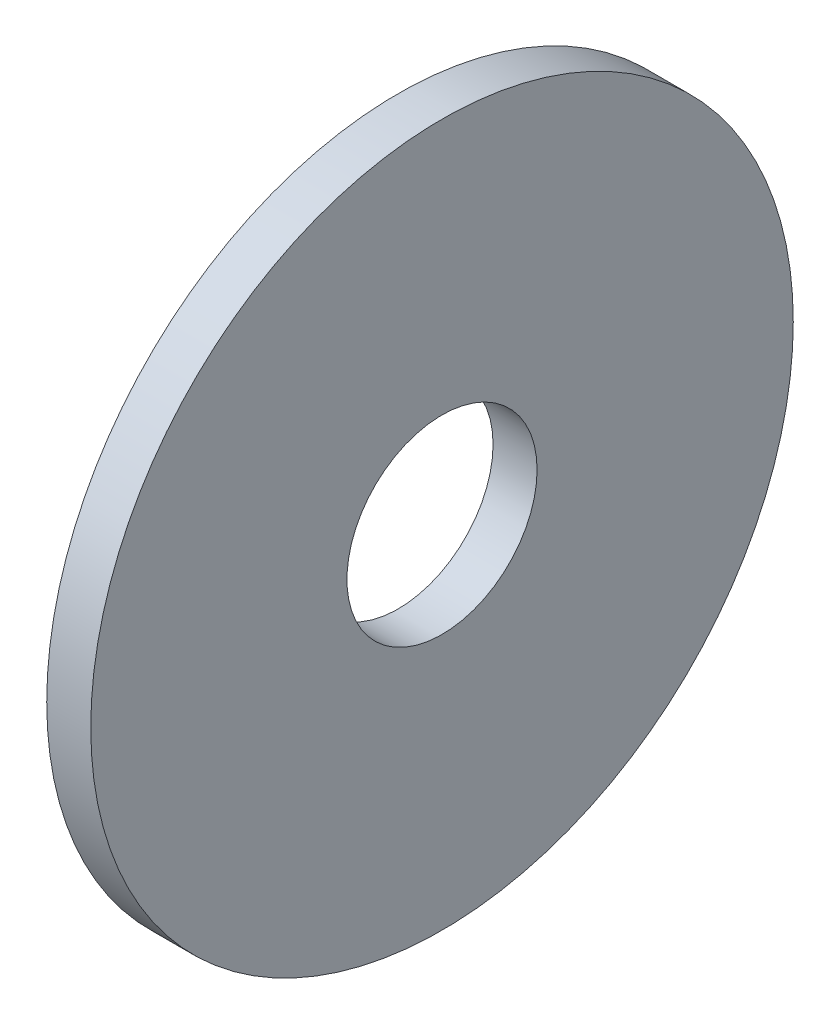
ISO-10303-21;
HEADER;
FILE_DESCRIPTION(('STEP AP214'),'2;1');
FILE_NAME('part.step','',(''),(''),'','','');
FILE_SCHEMA(('AUTOMOTIVE_DESIGN { 1 0 10303 214 1 1 1 1 }'));
ENDSEC;
DATA;
#1=APPLICATION_CONTEXT('core data for automotive mechanical design processes');
#2=APPLICATION_PROTOCOL_DEFINITION('international standard','automotive_design',2000,#1);
#3=PRODUCT_CONTEXT('',#1,'mechanical');
#4=PRODUCT('Part','Part','',(#3));
#5=PRODUCT_RELATED_PRODUCT_CATEGORY('part','',(#4));
#6=PRODUCT_DEFINITION_FORMATION('','',#4);
#7=PRODUCT_DEFINITION_CONTEXT('part definition',#1,'design');
#8=PRODUCT_DEFINITION('design','',#6,#7);
#9=PRODUCT_DEFINITION_SHAPE('','',#8);
#10=(LENGTH_UNIT() NAMED_UNIT(*) SI_UNIT(.MILLI.,.METRE.));
#11=(NAMED_UNIT(*) PLANE_ANGLE_UNIT() SI_UNIT($,.RADIAN.));
#12=(NAMED_UNIT(*) SI_UNIT($,.STERADIAN.) SOLID_ANGLE_UNIT());
#13=UNCERTAINTY_MEASURE_WITH_UNIT(LENGTH_MEASURE(1.E-05),#10,'distance_accuracy_value','');
#14=(GEOMETRIC_REPRESENTATION_CONTEXT(3) GLOBAL_UNCERTAINTY_ASSIGNED_CONTEXT((#13)) GLOBAL_UNIT_ASSIGNED_CONTEXT((#10,
#11,#12)) REPRESENTATION_CONTEXT('',''));
#15=CARTESIAN_POINT('',(0.,0.,0.));
#16=DIRECTION('',(0.,0.,1.));
#17=DIRECTION('',(1.,0.,0.));
#18=AXIS2_PLACEMENT_3D('',#15,#16,#17);
#19=CARTESIAN_POINT('',(1.1938,0.,0.));
#20=DIRECTION('',(1.,0.,0.));
#21=DIRECTION('',(0.,0.,-1.));
#22=AXIS2_PLACEMENT_3D('',#19,#20,#21);
#23=PLANE('',#22);
#24=CARTESIAN_POINT('',(1.1938,0.,0.));
#25=DIRECTION('',(1.,0.,0.));
#26=DIRECTION('',(0.,0.,-1.));
#27=AXIS2_PLACEMENT_3D('',#24,#25,#26);
#28=CIRCLE('',#27,9.525);
#29=CARTESIAN_POINT('',(1.1938,0.,-9.525));
#30=VERTEX_POINT('',#29);
#31=EDGE_CURVE('E10',#30,#30,#28,.T.);
#32=ORIENTED_EDGE('',*,*,#31,.T.);
#33=EDGE_LOOP('',(#32));
#34=FACE_BOUND('',#33,.T.);
#35=CARTESIAN_POINT('',(1.1938,0.,0.));
#36=DIRECTION('',(1.,0.,0.));
#37=DIRECTION('',(0.,0.,-1.));
#38=AXIS2_PLACEMENT_3D('',#35,#36,#37);
#39=CIRCLE('',#38,2.5781);
#40=CARTESIAN_POINT('',(1.1938,0.,-2.5781));
#41=VERTEX_POINT('',#40);
#42=EDGE_CURVE('E41',#41,#41,#39,.T.);
#43=ORIENTED_EDGE('',*,*,#42,.F.);
#44=EDGE_LOOP('',(#43));
#45=FACE_BOUND('',#44,.T.);
#46=ADVANCED_FACE('F30',(#34,#45),#23,.T.);
#47=CARTESIAN_POINT('',(0.,0.,0.));
#48=DIRECTION('',(1.,0.,0.));
#49=DIRECTION('',(0.,0.,-1.));
#50=AXIS2_PLACEMENT_3D('',#47,#48,#49);
#51=PLANE('',#50);
#52=CARTESIAN_POINT('',(0.,0.,0.));
#53=DIRECTION('',(1.,0.,0.));
#54=DIRECTION('',(0.,0.,-1.));
#55=AXIS2_PLACEMENT_3D('',#52,#53,#54);
#56=CIRCLE('',#55,9.525);
#57=CARTESIAN_POINT('',(0.,0.,-9.525));
#58=VERTEX_POINT('',#57);
#59=EDGE_CURVE('E34',#58,#58,#56,.T.);
#60=ORIENTED_EDGE('',*,*,#59,.F.);
#61=EDGE_LOOP('',(#60));
#62=FACE_BOUND('',#61,.T.);
#63=CARTESIAN_POINT('',(0.,0.,0.));
#64=DIRECTION('',(1.,0.,0.));
#65=DIRECTION('',(0.,0.,-1.));
#66=AXIS2_PLACEMENT_3D('',#63,#64,#65);
#67=CIRCLE('',#66,2.5781);
#68=CARTESIAN_POINT('',(0.,0.,-2.5781));
#69=VERTEX_POINT('',#68);
#70=EDGE_CURVE('E43',#69,#69,#67,.T.);
#71=ORIENTED_EDGE('',*,*,#70,.T.);
#72=EDGE_LOOP('',(#71));
#73=FACE_BOUND('',#72,.T.);
#74=ADVANCED_FACE('F53',(#62,#73),#51,.F.);
#75=CARTESIAN_POINT('',(1.1938,0.,0.));
#76=DIRECTION('',(-1.,0.,0.));
#77=DIRECTION('',(0.,0.,1.));
#78=AXIS2_PLACEMENT_3D('',#75,#76,#77);
#79=CYLINDRICAL_SURFACE('',#78,9.525);
#80=ORIENTED_EDGE('',*,*,#31,.F.);
#81=EDGE_LOOP('',(#80));
#82=FACE_BOUND('',#81,.T.);
#83=ORIENTED_EDGE('',*,*,#59,.T.);
#84=EDGE_LOOP('',(#83));
#85=FACE_BOUND('',#84,.T.);
#86=ADVANCED_FACE('F32',(#82,#85),#79,.T.);
#87=CARTESIAN_POINT('',(1.1938,0.,0.));
#88=DIRECTION('',(-1.,0.,0.));
#89=DIRECTION('',(0.,0.,1.));
#90=AXIS2_PLACEMENT_3D('',#87,#88,#89);
#91=CYLINDRICAL_SURFACE('',#90,2.5781);
#92=ORIENTED_EDGE('',*,*,#42,.T.);
#93=EDGE_LOOP('',(#92));
#94=FACE_BOUND('',#93,.T.);
#95=ORIENTED_EDGE('',*,*,#70,.F.);
#96=EDGE_LOOP('',(#95));
#97=FACE_BOUND('',#96,.T.);
#98=ADVANCED_FACE('F49',(#94,#97),#91,.F.);
#99=CLOSED_SHELL('',(#46,#74,#86,#98));
#100=MANIFOLD_SOLID_BREP('B2',#99);
#101=ADVANCED_BREP_SHAPE_REPRESENTATION('',(#18,#100),#14);
#102=SHAPE_DEFINITION_REPRESENTATION(#9,#101);
ENDSEC;
END-ISO-10303-21;
